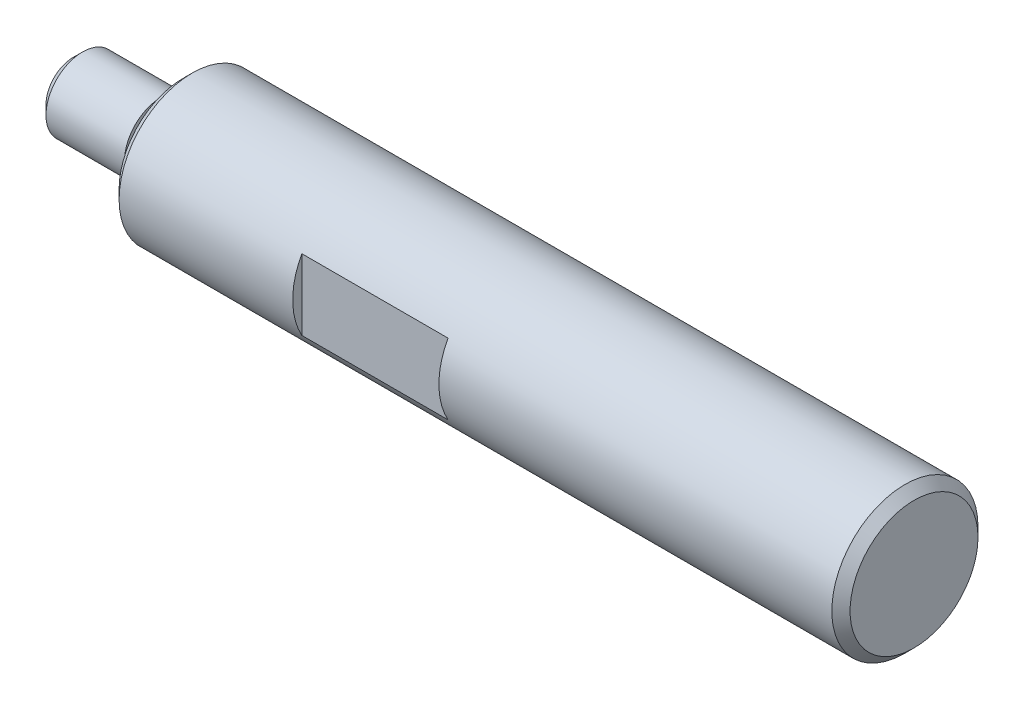
ISO-10303-21;
HEADER;
FILE_DESCRIPTION(('STEP AP214'),'2;1');
FILE_NAME('part.step','',(''),(''),'','','');
FILE_SCHEMA(('AUTOMOTIVE_DESIGN { 1 0 10303 214 1 1 1 1 }'));
ENDSEC;
DATA;
#1=APPLICATION_CONTEXT('core data for automotive mechanical design processes');
#2=APPLICATION_PROTOCOL_DEFINITION('international standard','automotive_design',2000,#1);
#3=PRODUCT_CONTEXT('',#1,'mechanical');
#4=PRODUCT('Part','Part','',(#3));
#5=PRODUCT_RELATED_PRODUCT_CATEGORY('part','',(#4));
#6=PRODUCT_DEFINITION_FORMATION('','',#4);
#7=PRODUCT_DEFINITION_CONTEXT('part definition',#1,'design');
#8=PRODUCT_DEFINITION('design','',#6,#7);
#9=PRODUCT_DEFINITION_SHAPE('','',#8);
#10=(LENGTH_UNIT() NAMED_UNIT(*) SI_UNIT(.MILLI.,.METRE.));
#11=(NAMED_UNIT(*) PLANE_ANGLE_UNIT() SI_UNIT($,.RADIAN.));
#12=(NAMED_UNIT(*) SI_UNIT($,.STERADIAN.) SOLID_ANGLE_UNIT());
#13=UNCERTAINTY_MEASURE_WITH_UNIT(LENGTH_MEASURE(1.E-05),#10,'distance_accuracy_value','');
#14=(GEOMETRIC_REPRESENTATION_CONTEXT(3) GLOBAL_UNCERTAINTY_ASSIGNED_CONTEXT((#13)) GLOBAL_UNIT_ASSIGNED_CONTEXT((#10,
#11,#12)) REPRESENTATION_CONTEXT('',''));
#15=CARTESIAN_POINT('',(0.,0.,0.));
#16=DIRECTION('',(0.,0.,1.));
#17=DIRECTION('',(1.,0.,0.));
#18=AXIS2_PLACEMENT_3D('',#15,#16,#17);
#19=CARTESIAN_POINT('',(-6.,0.,0.));
#20=DIRECTION('',(1.,0.,0.));
#21=DIRECTION('',(0.,0.,-1.));
#22=AXIS2_PLACEMENT_3D('',#19,#20,#21);
#23=CYLINDRICAL_SURFACE('',#22,4.);
#24=CARTESIAN_POINT('',(39.5,0.,0.));
#25=DIRECTION('',(1.,0.,0.));
#26=DIRECTION('',(0.,0.,-1.));
#27=AXIS2_PLACEMENT_3D('',#24,#25,#26);
#28=CIRCLE('',#27,4.);
#29=CARTESIAN_POINT('',(39.5,0.,-4.));
#30=VERTEX_POINT('',#29);
#31=EDGE_CURVE('E45',#30,#30,#28,.F.);
#32=ORIENTED_EDGE('',*,*,#31,.T.);
#33=EDGE_LOOP('',(#32));
#34=FACE_BOUND('',#33,.T.);
#35=CARTESIAN_POINT('',(0.499999999999986,0.,0.));
#36=DIRECTION('',(-1.,0.,0.));
#37=DIRECTION('',(0.,0.,1.));
#38=AXIS2_PLACEMENT_3D('',#35,#36,#37);
#39=CIRCLE('',#38,4.);
#40=CARTESIAN_POINT('',(0.499999999999986,0.,4.));
#41=VERTEX_POINT('',#40);
#42=EDGE_CURVE('E129',#41,#41,#39,.F.);
#43=ORIENTED_EDGE('',*,*,#42,.T.);
#44=EDGE_LOOP('',(#43));
#45=FACE_BOUND('',#44,.T.);
#46=DIRECTION('',(-1.,0.,0.));
#47=VECTOR('',#46,1.);
#48=CARTESIAN_POINT('',(18.,-1.93649167310371,-3.5));
#49=LINE('',#48,#47);
#50=CARTESIAN_POINT('',(18.,-1.93649167310371,-3.5));
#51=VERTEX_POINT('',#50);
#52=CARTESIAN_POINT('',(10.,-1.93649167310371,-3.5));
#53=VERTEX_POINT('',#52);
#54=EDGE_CURVE('E103',#51,#53,#49,.T.);
#55=ORIENTED_EDGE('',*,*,#54,.F.);
#56=CARTESIAN_POINT('',(18.,0.,0.));
#57=DIRECTION('',(-1.,0.,0.));
#58=DIRECTION('',(0.,0.,1.));
#59=AXIS2_PLACEMENT_3D('',#56,#57,#58);
#60=CIRCLE('',#59,4.);
#61=CARTESIAN_POINT('',(18.,1.93649167310371,-3.5));
#62=VERTEX_POINT('',#61);
#63=EDGE_CURVE('E98',#62,#51,#60,.T.);
#64=ORIENTED_EDGE('',*,*,#63,.F.);
#65=DIRECTION('',(-1.,0.,0.));
#66=VECTOR('',#65,1.);
#67=CARTESIAN_POINT('',(18.,1.93649167310371,-3.5));
#68=LINE('',#67,#66);
#69=CARTESIAN_POINT('',(10.,1.93649167310371,-3.5));
#70=VERTEX_POINT('',#69);
#71=EDGE_CURVE('E107',#62,#70,#68,.T.);
#72=ORIENTED_EDGE('',*,*,#71,.T.);
#73=CARTESIAN_POINT('',(10.,0.,0.));
#74=DIRECTION('',(-1.,0.,0.));
#75=DIRECTION('',(0.,0.,1.));
#76=AXIS2_PLACEMENT_3D('',#73,#74,#75);
#77=CIRCLE('',#76,4.);
#78=EDGE_CURVE('E94',#70,#53,#77,.T.);
#79=ORIENTED_EDGE('',*,*,#78,.T.);
#80=EDGE_LOOP('',(#55,#64,#72,#79));
#81=FACE_BOUND('',#80,.T.);
#82=DIRECTION('',(-1.,0.,0.));
#83=VECTOR('',#82,1.);
#84=CARTESIAN_POINT('',(18.,1.93649162215487,3.50000002818914));
#85=LINE('',#84,#83);
#86=CARTESIAN_POINT('',(18.,1.93649162215487,3.50000002818914));
#87=VERTEX_POINT('',#86);
#88=CARTESIAN_POINT('',(10.,1.93649162215487,3.50000002818914));
#89=VERTEX_POINT('',#88);
#90=EDGE_CURVE('E88',#87,#89,#85,.T.);
#91=ORIENTED_EDGE('',*,*,#90,.F.);
#92=CARTESIAN_POINT('',(18.,0.,0.));
#93=DIRECTION('',(-1.,0.,0.));
#94=DIRECTION('',(0.,0.,1.));
#95=AXIS2_PLACEMENT_3D('',#92,#93,#94);
#96=CIRCLE('',#95,4.);
#97=CARTESIAN_POINT('',(18.,-1.93649162215487,3.50000002818914));
#98=VERTEX_POINT('',#97);
#99=EDGE_CURVE('E78',#98,#87,#96,.T.);
#100=ORIENTED_EDGE('',*,*,#99,.F.);
#101=DIRECTION('',(-1.,0.,0.));
#102=VECTOR('',#101,1.);
#103=CARTESIAN_POINT('',(18.,-1.93649162215487,3.50000002818914));
#104=LINE('',#103,#102);
#105=CARTESIAN_POINT('',(10.,-1.93649162215487,3.50000002818914));
#106=VERTEX_POINT('',#105);
#107=EDGE_CURVE('E90',#98,#106,#104,.T.);
#108=ORIENTED_EDGE('',*,*,#107,.T.);
#109=CARTESIAN_POINT('',(10.,0.,0.));
#110=DIRECTION('',(-1.,0.,0.));
#111=DIRECTION('',(0.,0.,1.));
#112=AXIS2_PLACEMENT_3D('',#109,#110,#111);
#113=CIRCLE('',#112,4.);
#114=EDGE_CURVE('E92',#106,#89,#113,.T.);
#115=ORIENTED_EDGE('',*,*,#114,.T.);
#116=EDGE_LOOP('',(#91,#100,#108,#115));
#117=FACE_BOUND('',#116,.T.);
#118=ADVANCED_FACE('F36',(#34,#45,#81,#117),#23,.T.);
#119=CARTESIAN_POINT('',(-6.,0.,0.));
#120=DIRECTION('',(1.,0.,0.));
#121=DIRECTION('',(0.,0.,-1.));
#122=AXIS2_PLACEMENT_3D('',#119,#120,#121);
#123=CYLINDRICAL_SURFACE('',#122,2.);
#124=CARTESIAN_POINT('',(-5.50000000000001,0.,0.));
#125=DIRECTION('',(-1.,0.,0.));
#126=DIRECTION('',(0.,0.,1.));
#127=AXIS2_PLACEMENT_3D('',#124,#125,#126);
#128=CIRCLE('',#127,2.);
#129=CARTESIAN_POINT('',(-5.50000000000001,0.,2.));
#130=VERTEX_POINT('',#129);
#131=EDGE_CURVE('E120',#130,#130,#128,.F.);
#132=ORIENTED_EDGE('',*,*,#131,.T.);
#133=EDGE_LOOP('',(#132));
#134=FACE_BOUND('',#133,.T.);
#135=CARTESIAN_POINT('',(-1.2,0.,0.));
#136=DIRECTION('',(1.,0.,0.));
#137=DIRECTION('',(0.,0.,-1.));
#138=AXIS2_PLACEMENT_3D('',#135,#136,#137);
#139=CIRCLE('',#138,2.);
#140=CARTESIAN_POINT('',(-1.2,0.,-2.));
#141=VERTEX_POINT('',#140);
#142=EDGE_CURVE('E110',#141,#141,#139,.T.);
#143=ORIENTED_EDGE('',*,*,#142,.F.);
#144=EDGE_LOOP('',(#143));
#145=FACE_BOUND('',#144,.T.);
#146=ADVANCED_FACE('F154',(#134,#145),#123,.T.);
#147=CARTESIAN_POINT('',(-6.,2.,0.));
#148=DIRECTION('',(-1.,0.,0.));
#149=DIRECTION('',(0.,0.,1.));
#150=AXIS2_PLACEMENT_3D('',#147,#148,#149);
#151=PLANE('',#150);
#152=CARTESIAN_POINT('',(-6.,0.,0.));
#153=DIRECTION('',(-1.,0.,0.));
#154=DIRECTION('',(0.,0.,1.));
#155=AXIS2_PLACEMENT_3D('',#152,#153,#154);
#156=CIRCLE('',#155,1.50000000000001);
#157=CARTESIAN_POINT('',(-6.,0.,1.50000000000001));
#158=VERTEX_POINT('',#157);
#159=EDGE_CURVE('E123',#158,#158,#156,.T.);
#160=ORIENTED_EDGE('',*,*,#159,.T.);
#161=EDGE_LOOP('',(#160));
#162=FACE_BOUND('',#161,.T.);
#163=ADVANCED_FACE('F145',(#162),#151,.T.);
#164=CARTESIAN_POINT('',(40.,0.,0.));
#165=DIRECTION('',(1.,0.,0.));
#166=DIRECTION('',(0.,0.,-1.));
#167=AXIS2_PLACEMENT_3D('',#164,#165,#166);
#168=PLANE('',#167);
#169=CARTESIAN_POINT('',(40.,0.,0.));
#170=DIRECTION('',(1.,0.,0.));
#171=DIRECTION('',(0.,0.,-1.));
#172=AXIS2_PLACEMENT_3D('',#169,#170,#171);
#173=CIRCLE('',#172,3.50000000000001);
#174=CARTESIAN_POINT('',(40.,0.,-3.50000000000001));
#175=VERTEX_POINT('',#174);
#176=EDGE_CURVE('E126',#175,#175,#173,.T.);
#177=ORIENTED_EDGE('',*,*,#176,.T.);
#178=EDGE_LOOP('',(#177));
#179=FACE_BOUND('',#178,.T.);
#180=ADVANCED_FACE('F142',(#179),#168,.T.);
#181=CARTESIAN_POINT('',(0.,4.,0.));
#182=DIRECTION('',(-1.,0.,0.));
#183=DIRECTION('',(0.,0.,1.));
#184=AXIS2_PLACEMENT_3D('',#181,#182,#183);
#185=PLANE('',#184);
#186=CARTESIAN_POINT('',(0.,0.,0.));
#187=DIRECTION('',(-1.,0.,0.));
#188=DIRECTION('',(0.,0.,1.));
#189=AXIS2_PLACEMENT_3D('',#186,#187,#188);
#190=CIRCLE('',#189,3.50000000000001);
#191=CARTESIAN_POINT('',(0.,0.,3.50000000000001));
#192=VERTEX_POINT('',#191);
#193=EDGE_CURVE('E11',#192,#192,#190,.T.);
#194=ORIENTED_EDGE('',*,*,#193,.T.);
#195=EDGE_LOOP('',(#194));
#196=FACE_BOUND('',#195,.T.);
#197=CARTESIAN_POINT('',(0.,0.,0.));
#198=DIRECTION('',(1.,0.,0.));
#199=DIRECTION('',(0.,0.,-1.));
#200=AXIS2_PLACEMENT_3D('',#197,#198,#199);
#201=CIRCLE('',#200,1.6);
#202=CARTESIAN_POINT('',(0.,0.,-1.6));
#203=VERTEX_POINT('',#202);
#204=EDGE_CURVE('E117',#203,#203,#201,.T.);
#205=ORIENTED_EDGE('',*,*,#204,.T.);
#206=EDGE_LOOP('',(#205));
#207=FACE_BOUND('',#206,.T.);
#208=ADVANCED_FACE('F144',(#196,#207),#185,.T.);
#209=CARTESIAN_POINT('',(-6.,0.,0.));
#210=DIRECTION('',(1.,0.,0.));
#211=DIRECTION('',(0.,0.,-1.));
#212=AXIS2_PLACEMENT_3D('',#209,#210,#211);
#213=CYLINDRICAL_SURFACE('',#212,1.6);
#214=CARTESIAN_POINT('',(-1.2,0.,0.));
#215=DIRECTION('',(1.,0.,0.));
#216=DIRECTION('',(0.,0.,-1.));
#217=AXIS2_PLACEMENT_3D('',#214,#215,#216);
#218=CIRCLE('',#217,1.6);
#219=CARTESIAN_POINT('',(-1.2,0.,-1.6));
#220=VERTEX_POINT('',#219);
#221=EDGE_CURVE('E114',#220,#220,#218,.T.);
#222=ORIENTED_EDGE('',*,*,#221,.T.);
#223=EDGE_LOOP('',(#222));
#224=FACE_BOUND('',#223,.T.);
#225=ORIENTED_EDGE('',*,*,#204,.F.);
#226=EDGE_LOOP('',(#225));
#227=FACE_BOUND('',#226,.T.);
#228=ADVANCED_FACE('F151',(#224,#227),#213,.T.);
#229=CARTESIAN_POINT('',(-1.2,1.6,0.));
#230=DIRECTION('',(1.,0.,0.));
#231=DIRECTION('',(0.,0.,-1.));
#232=AXIS2_PLACEMENT_3D('',#229,#230,#231);
#233=PLANE('',#232);
#234=ORIENTED_EDGE('',*,*,#142,.T.);
#235=EDGE_LOOP('',(#234));
#236=FACE_BOUND('',#235,.T.);
#237=ORIENTED_EDGE('',*,*,#221,.F.);
#238=EDGE_LOOP('',(#237));
#239=FACE_BOUND('',#238,.T.);
#240=ADVANCED_FACE('F167',(#236,#239),#233,.T.);
#241=CARTESIAN_POINT('',(18.,-1.93649167310371,-3.5));
#242=DIRECTION('',(0.,0.,1.));
#243=DIRECTION('',(1.,0.,0.));
#244=AXIS2_PLACEMENT_3D('',#241,#242,#243);
#245=PLANE('',#244);
#246=DIRECTION('',(0.,1.,0.));
#247=VECTOR('',#246,1.);
#248=CARTESIAN_POINT('',(10.,-1.93649167310371,-3.5));
#249=LINE('',#248,#247);
#250=EDGE_CURVE('E58',#53,#70,#249,.T.);
#251=ORIENTED_EDGE('',*,*,#250,.T.);
#252=ORIENTED_EDGE('',*,*,#71,.F.);
#253=DIRECTION('',(0.,1.,0.));
#254=VECTOR('',#253,1.);
#255=CARTESIAN_POINT('',(18.,-1.93649167310371,-3.5));
#256=LINE('',#255,#254);
#257=EDGE_CURVE('E100',#51,#62,#256,.T.);
#258=ORIENTED_EDGE('',*,*,#257,.F.);
#259=ORIENTED_EDGE('',*,*,#54,.T.);
#260=EDGE_LOOP('',(#251,#252,#258,#259));
#261=FACE_BOUND('',#260,.T.);
#262=ADVANCED_FACE('F171',(#261),#245,.F.);
#263=CARTESIAN_POINT('',(18.,0.,0.));
#264=DIRECTION('',(-1.,0.,0.));
#265=DIRECTION('',(0.,0.,1.));
#266=AXIS2_PLACEMENT_3D('',#263,#264,#265);
#267=PLANE('',#266);
#268=ORIENTED_EDGE('',*,*,#63,.T.);
#269=ORIENTED_EDGE('',*,*,#257,.T.);
#270=EDGE_LOOP('',(#268,#269));
#271=FACE_BOUND('',#270,.T.);
#272=ADVANCED_FACE('F175',(#271),#267,.T.);
#273=CARTESIAN_POINT('',(10.,0.,0.));
#274=DIRECTION('',(-1.,0.,0.));
#275=DIRECTION('',(0.,0.,1.));
#276=AXIS2_PLACEMENT_3D('',#273,#274,#275);
#277=PLANE('',#276);
#278=ORIENTED_EDGE('',*,*,#78,.F.);
#279=ORIENTED_EDGE('',*,*,#250,.F.);
#280=EDGE_LOOP('',(#278,#279));
#281=FACE_BOUND('',#280,.T.);
#282=ADVANCED_FACE('F177',(#281),#277,.F.);
#283=CARTESIAN_POINT('',(18.,1.93649162215487,3.50000002818914));
#284=DIRECTION('',(0.,0.,-1.));
#285=DIRECTION('',(0.,1.,0.));
#286=AXIS2_PLACEMENT_3D('',#283,#284,#285);
#287=PLANE('',#286);
#288=DIRECTION('',(0.,-1.,0.));
#289=VECTOR('',#288,1.);
#290=CARTESIAN_POINT('',(10.,1.93649162215487,3.50000002818914));
#291=LINE('',#290,#289);
#292=EDGE_CURVE('E51',#89,#106,#291,.T.);
#293=ORIENTED_EDGE('',*,*,#292,.T.);
#294=ORIENTED_EDGE('',*,*,#107,.F.);
#295=DIRECTION('',(0.,-1.,0.));
#296=VECTOR('',#295,1.);
#297=CARTESIAN_POINT('',(18.,1.93649162215487,3.50000002818914));
#298=LINE('',#297,#296);
#299=EDGE_CURVE('E81',#87,#98,#298,.T.);
#300=ORIENTED_EDGE('',*,*,#299,.F.);
#301=ORIENTED_EDGE('',*,*,#90,.T.);
#302=EDGE_LOOP('',(#293,#294,#300,#301));
#303=FACE_BOUND('',#302,.T.);
#304=ADVANCED_FACE('F87',(#303),#287,.F.);
#305=CARTESIAN_POINT('',(18.,0.,0.));
#306=DIRECTION('',(-1.,0.,0.));
#307=DIRECTION('',(0.,0.,1.));
#308=AXIS2_PLACEMENT_3D('',#305,#306,#307);
#309=PLANE('',#308);
#310=ORIENTED_EDGE('',*,*,#99,.T.);
#311=ORIENTED_EDGE('',*,*,#299,.T.);
#312=EDGE_LOOP('',(#310,#311));
#313=FACE_BOUND('',#312,.T.);
#314=ADVANCED_FACE('F80',(#313),#309,.T.);
#315=CARTESIAN_POINT('',(10.,0.,0.));
#316=DIRECTION('',(-1.,0.,0.));
#317=DIRECTION('',(0.,0.,1.));
#318=AXIS2_PLACEMENT_3D('',#315,#316,#317);
#319=PLANE('',#318);
#320=ORIENTED_EDGE('',*,*,#114,.F.);
#321=ORIENTED_EDGE('',*,*,#292,.F.);
#322=EDGE_LOOP('',(#320,#321));
#323=FACE_BOUND('',#322,.T.);
#324=ADVANCED_FACE('F185',(#323),#319,.F.);
#325=CARTESIAN_POINT('',(-5.50000000000001,0.,0.));
#326=DIRECTION('',(1.,0.,0.));
#327=DIRECTION('',(0.,0.,-1.));
#328=AXIS2_PLACEMENT_3D('',#325,#326,#327);
#329=CONICAL_SURFACE('',#328,2.,0.785398163397452);
#330=ORIENTED_EDGE('',*,*,#159,.F.);
#331=EDGE_LOOP('',(#330));
#332=FACE_BOUND('',#331,.T.);
#333=ORIENTED_EDGE('',*,*,#131,.F.);
#334=EDGE_LOOP('',(#333));
#335=FACE_BOUND('',#334,.T.);
#336=ADVANCED_FACE('F139',(#332,#335),#329,.T.);
#337=CARTESIAN_POINT('',(40.,0.,0.));
#338=DIRECTION('',(-1.,0.,0.));
#339=DIRECTION('',(0.,0.,1.));
#340=AXIS2_PLACEMENT_3D('',#337,#338,#339);
#341=CONICAL_SURFACE('',#340,3.50000000000001,0.785398163397445);
#342=ORIENTED_EDGE('',*,*,#31,.F.);
#343=EDGE_LOOP('',(#342));
#344=FACE_BOUND('',#343,.T.);
#345=ORIENTED_EDGE('',*,*,#176,.F.);
#346=EDGE_LOOP('',(#345));
#347=FACE_BOUND('',#346,.T.);
#348=ADVANCED_FACE('F136',(#344,#347),#341,.T.);
#349=CARTESIAN_POINT('',(0.499999999999986,0.,0.));
#350=DIRECTION('',(1.,0.,0.));
#351=DIRECTION('',(0.,0.,-1.));
#352=AXIS2_PLACEMENT_3D('',#349,#350,#351);
#353=CONICAL_SURFACE('',#352,4.,0.785398163397449);
#354=ORIENTED_EDGE('',*,*,#193,.F.);
#355=EDGE_LOOP('',(#354));
#356=FACE_BOUND('',#355,.T.);
#357=ORIENTED_EDGE('',*,*,#42,.F.);
#358=EDGE_LOOP('',(#357));
#359=FACE_BOUND('',#358,.T.);
#360=ADVANCED_FACE('F39',(#356,#359),#353,.T.);
#361=CLOSED_SHELL('',(#118,#146,#163,#180,#208,#228,#240,#262,#272,#282,#304,#314,#324,#336,
#348,#360));
#362=MANIFOLD_SOLID_BREP('B2',#361);
#363=ADVANCED_BREP_SHAPE_REPRESENTATION('',(#18,#362),#14);
#364=SHAPE_DEFINITION_REPRESENTATION(#9,#363);
ENDSEC;
END-ISO-10303-21;
